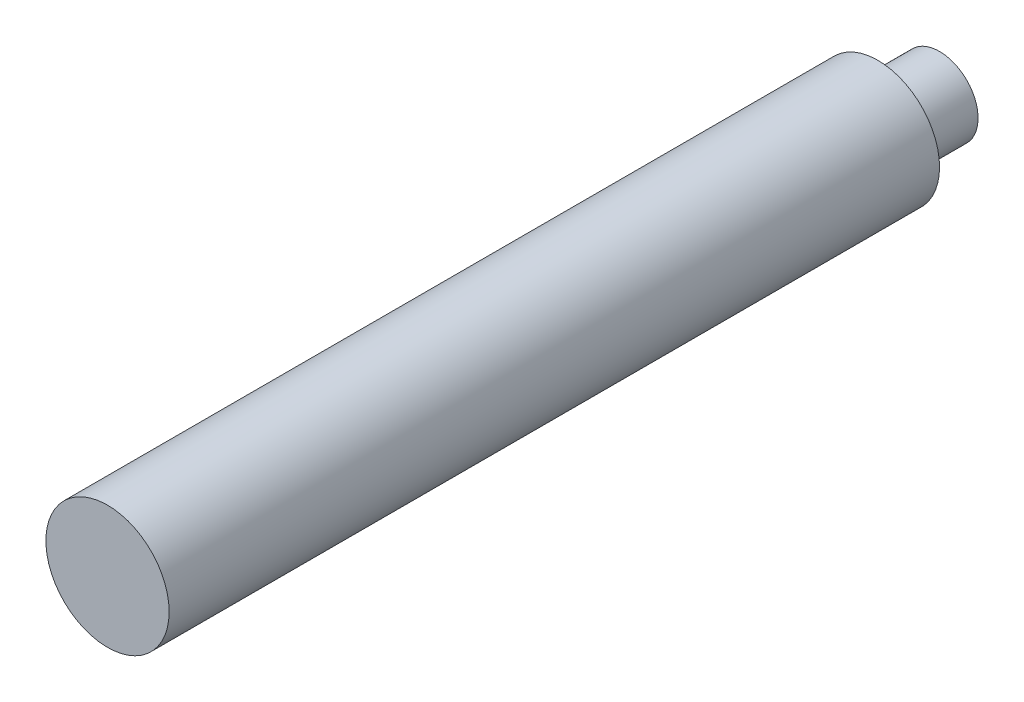
ISO-10303-21;
HEADER;
FILE_DESCRIPTION(('STEP AP214'),'2;1');
FILE_NAME('part.step','',(''),(''),'','','');
FILE_SCHEMA(('AUTOMOTIVE_DESIGN { 1 0 10303 214 1 1 1 1 }'));
ENDSEC;
DATA;
#1=APPLICATION_CONTEXT('core data for automotive mechanical design processes');
#2=APPLICATION_PROTOCOL_DEFINITION('international standard','automotive_design',2000,#1);
#3=PRODUCT_CONTEXT('',#1,'mechanical');
#4=PRODUCT('Part','Part','',(#3));
#5=PRODUCT_RELATED_PRODUCT_CATEGORY('part','',(#4));
#6=PRODUCT_DEFINITION_FORMATION('','',#4);
#7=PRODUCT_DEFINITION_CONTEXT('part definition',#1,'design');
#8=PRODUCT_DEFINITION('design','',#6,#7);
#9=PRODUCT_DEFINITION_SHAPE('','',#8);
#10=(LENGTH_UNIT() NAMED_UNIT(*) SI_UNIT(.MILLI.,.METRE.));
#11=(NAMED_UNIT(*) PLANE_ANGLE_UNIT() SI_UNIT($,.RADIAN.));
#12=(NAMED_UNIT(*) SI_UNIT($,.STERADIAN.) SOLID_ANGLE_UNIT());
#13=UNCERTAINTY_MEASURE_WITH_UNIT(LENGTH_MEASURE(1.E-05),#10,'distance_accuracy_value','');
#14=(GEOMETRIC_REPRESENTATION_CONTEXT(3) GLOBAL_UNCERTAINTY_ASSIGNED_CONTEXT((#13)) GLOBAL_UNIT_ASSIGNED_CONTEXT((#10,
#11,#12)) REPRESENTATION_CONTEXT('',''));
#15=CARTESIAN_POINT('',(0.,0.,0.));
#16=DIRECTION('',(0.,0.,1.));
#17=DIRECTION('',(1.,0.,0.));
#18=AXIS2_PLACEMENT_3D('',#15,#16,#17);
#19=CARTESIAN_POINT('',(0.,0.,63.5));
#20=DIRECTION('',(0.,0.,-1.));
#21=DIRECTION('',(-1.,0.,0.));
#22=AXIS2_PLACEMENT_3D('',#19,#20,#21);
#23=CYLINDRICAL_SURFACE('',#22,5.08);
#24=CARTESIAN_POINT('',(0.,0.,63.5));
#25=DIRECTION('',(0.,0.,1.));
#26=DIRECTION('',(1.,0.,0.));
#27=AXIS2_PLACEMENT_3D('',#24,#25,#26);
#28=CIRCLE('',#27,5.08);
#29=CARTESIAN_POINT('',(5.08,0.,63.5));
#30=VERTEX_POINT('',#29);
#31=EDGE_CURVE('E40',#30,#30,#28,.T.);
#32=ORIENTED_EDGE('',*,*,#31,.F.);
#33=EDGE_LOOP('',(#32));
#34=FACE_BOUND('',#33,.T.);
#35=CARTESIAN_POINT('',(0.,0.,0.));
#36=DIRECTION('',(0.,0.,1.));
#37=DIRECTION('',(1.,0.,0.));
#38=AXIS2_PLACEMENT_3D('',#35,#36,#37);
#39=CIRCLE('',#38,5.08);
#40=CARTESIAN_POINT('',(5.08,0.,0.));
#41=VERTEX_POINT('',#40);
#42=EDGE_CURVE('E36',#41,#41,#39,.T.);
#43=ORIENTED_EDGE('',*,*,#42,.T.);
#44=EDGE_LOOP('',(#43));
#45=FACE_BOUND('',#44,.T.);
#46=ADVANCED_FACE('F33',(#34,#45),#23,.T.);
#47=CARTESIAN_POINT('',(0.,0.,63.5));
#48=DIRECTION('',(0.,0.,1.));
#49=DIRECTION('',(1.,0.,0.));
#50=AXIS2_PLACEMENT_3D('',#47,#48,#49);
#51=PLANE('',#50);
#52=ORIENTED_EDGE('',*,*,#31,.T.);
#53=EDGE_LOOP('',(#52));
#54=FACE_BOUND('',#53,.T.);
#55=ADVANCED_FACE('F57',(#54),#51,.T.);
#56=CARTESIAN_POINT('',(0.,0.,0.));
#57=DIRECTION('',(0.,0.,1.));
#58=DIRECTION('',(1.,0.,0.));
#59=AXIS2_PLACEMENT_3D('',#56,#57,#58);
#60=PLANE('',#59);
#61=CARTESIAN_POINT('',(0.,0.,0.));
#62=DIRECTION('',(0.,0.,-1.));
#63=DIRECTION('',(-1.,0.,0.));
#64=AXIS2_PLACEMENT_3D('',#61,#62,#63);
#65=CIRCLE('',#64,3.175);
#66=CARTESIAN_POINT('',(-3.175,0.,0.));
#67=VERTEX_POINT('',#66);
#68=EDGE_CURVE('E10',#67,#67,#65,.T.);
#69=ORIENTED_EDGE('',*,*,#68,.F.);
#70=EDGE_LOOP('',(#69));
#71=FACE_BOUND('',#70,.T.);
#72=ORIENTED_EDGE('',*,*,#42,.F.);
#73=EDGE_LOOP('',(#72));
#74=FACE_BOUND('',#73,.T.);
#75=ADVANCED_FACE('F54',(#71,#74),#60,.F.);
#76=CARTESIAN_POINT('',(0.,0.,-5.08));
#77=DIRECTION('',(0.,0.,1.));
#78=DIRECTION('',(1.,0.,0.));
#79=AXIS2_PLACEMENT_3D('',#76,#77,#78);
#80=CYLINDRICAL_SURFACE('',#79,3.175);
#81=CARTESIAN_POINT('',(0.,0.,-5.08));
#82=DIRECTION('',(0.,0.,-1.));
#83=DIRECTION('',(-1.,0.,0.));
#84=AXIS2_PLACEMENT_3D('',#81,#82,#83);
#85=CIRCLE('',#84,3.175);
#86=CARTESIAN_POINT('',(-3.175,0.,-5.08));
#87=VERTEX_POINT('',#86);
#88=EDGE_CURVE('E46',#87,#87,#85,.T.);
#89=ORIENTED_EDGE('',*,*,#88,.F.);
#90=EDGE_LOOP('',(#89));
#91=FACE_BOUND('',#90,.T.);
#92=ORIENTED_EDGE('',*,*,#68,.T.);
#93=EDGE_LOOP('',(#92));
#94=FACE_BOUND('',#93,.T.);
#95=ADVANCED_FACE('F56',(#91,#94),#80,.T.);
#96=CARTESIAN_POINT('',(0.,0.,-5.08));
#97=DIRECTION('',(0.,0.,-1.));
#98=DIRECTION('',(-1.,0.,0.));
#99=AXIS2_PLACEMENT_3D('',#96,#97,#98);
#100=PLANE('',#99);
#101=ORIENTED_EDGE('',*,*,#88,.T.);
#102=EDGE_LOOP('',(#101));
#103=FACE_BOUND('',#102,.T.);
#104=ADVANCED_FACE('F63',(#103),#100,.T.);
#105=CLOSED_SHELL('',(#46,#55,#75,#95,#104));
#106=MANIFOLD_SOLID_BREP('B2',#105);
#107=ADVANCED_BREP_SHAPE_REPRESENTATION('',(#18,#106),#14);
#108=SHAPE_DEFINITION_REPRESENTATION(#9,#107);
ENDSEC;
END-ISO-10303-21;
